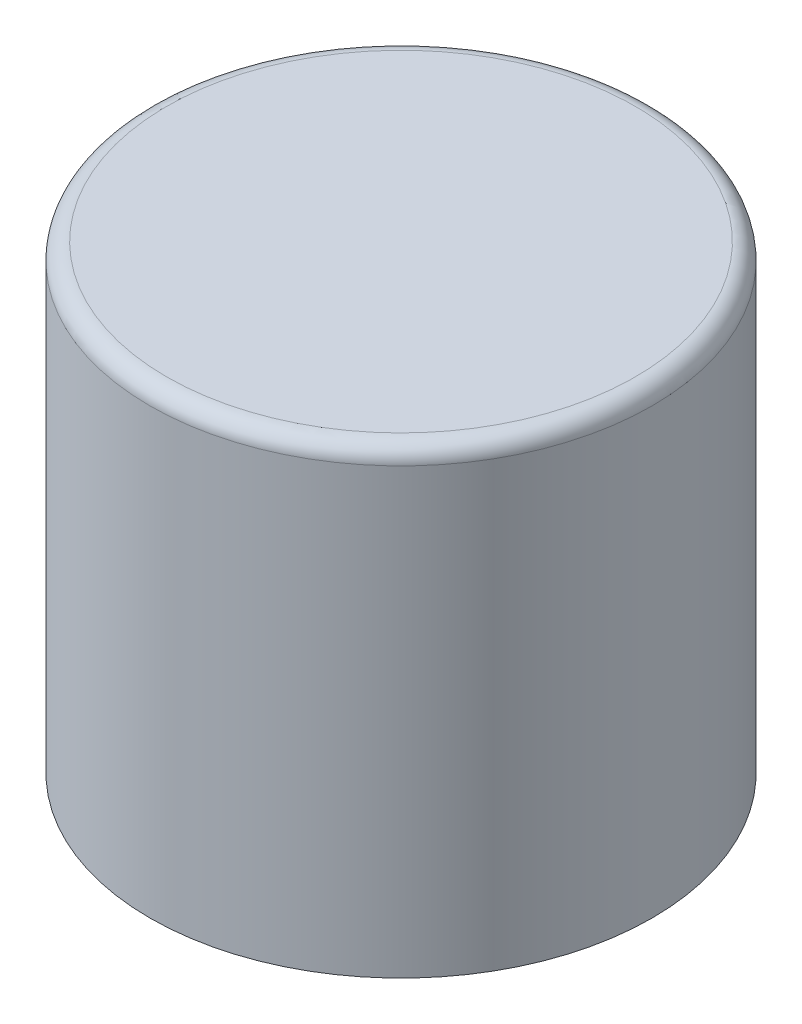
ISO-10303-21;
HEADER;
FILE_DESCRIPTION(('STEP AP214'),'2;1');
FILE_NAME('part.step','',(''),(''),'','','');
FILE_SCHEMA(('AUTOMOTIVE_DESIGN { 1 0 10303 214 1 1 1 1 }'));
ENDSEC;
DATA;
#1=APPLICATION_CONTEXT('core data for automotive mechanical design processes');
#2=APPLICATION_PROTOCOL_DEFINITION('international standard','automotive_design',2000,#1);
#3=PRODUCT_CONTEXT('',#1,'mechanical');
#4=PRODUCT('Part','Part','',(#3));
#5=PRODUCT_RELATED_PRODUCT_CATEGORY('part','',(#4));
#6=PRODUCT_DEFINITION_FORMATION('','',#4);
#7=PRODUCT_DEFINITION_CONTEXT('part definition',#1,'design');
#8=PRODUCT_DEFINITION('design','',#6,#7);
#9=PRODUCT_DEFINITION_SHAPE('','',#8);
#10=(LENGTH_UNIT() NAMED_UNIT(*) SI_UNIT(.MILLI.,.METRE.));
#11=(NAMED_UNIT(*) PLANE_ANGLE_UNIT() SI_UNIT($,.RADIAN.));
#12=(NAMED_UNIT(*) SI_UNIT($,.STERADIAN.) SOLID_ANGLE_UNIT());
#13=UNCERTAINTY_MEASURE_WITH_UNIT(LENGTH_MEASURE(1.E-05),#10,'distance_accuracy_value','');
#14=(GEOMETRIC_REPRESENTATION_CONTEXT(3) GLOBAL_UNCERTAINTY_ASSIGNED_CONTEXT((#13)) GLOBAL_UNIT_ASSIGNED_CONTEXT((#10,
#11,#12)) REPRESENTATION_CONTEXT('',''));
#15=CARTESIAN_POINT('',(0.,0.,0.));
#16=DIRECTION('',(0.,0.,1.));
#17=DIRECTION('',(1.,0.,0.));
#18=AXIS2_PLACEMENT_3D('',#15,#16,#17);
#19=CARTESIAN_POINT('',(0.,0.,0.));
#20=DIRECTION('',(0.,1.,0.));
#21=DIRECTION('',(0.,0.,1.));
#22=AXIS2_PLACEMENT_3D('',#19,#20,#21);
#23=CYLINDRICAL_SURFACE('',#22,3.);
#24=CARTESIAN_POINT('',(0.,5.3,0.));
#25=DIRECTION('',(0.,1.,0.));
#26=DIRECTION('',(0.,0.,1.));
#27=AXIS2_PLACEMENT_3D('',#24,#25,#26);
#28=CIRCLE('',#27,3.);
#29=CARTESIAN_POINT('',(0.,5.3,3.));
#30=VERTEX_POINT('',#29);
#31=EDGE_CURVE('E11',#30,#30,#28,.F.);
#32=ORIENTED_EDGE('',*,*,#31,.T.);
#33=EDGE_LOOP('',(#32));
#34=FACE_BOUND('',#33,.T.);
#35=CARTESIAN_POINT('',(0.,0.,0.));
#36=DIRECTION('',(0.,1.,0.));
#37=DIRECTION('',(0.,0.,1.));
#38=AXIS2_PLACEMENT_3D('',#35,#36,#37);
#39=CIRCLE('',#38,3.);
#40=CARTESIAN_POINT('',(0.,0.,3.));
#41=VERTEX_POINT('',#40);
#42=EDGE_CURVE('E112',#41,#41,#39,.T.);
#43=ORIENTED_EDGE('',*,*,#42,.T.);
#44=EDGE_LOOP('',(#43));
#45=FACE_BOUND('',#44,.T.);
#46=ADVANCED_FACE('F36',(#34,#45),#23,.T.);
#47=CARTESIAN_POINT('',(3.,0.,0.));
#48=DIRECTION('',(0.,-1.,0.));
#49=DIRECTION('',(0.,0.,-1.));
#50=AXIS2_PLACEMENT_3D('',#47,#48,#49);
#51=PLANE('',#50);
#52=DIRECTION('',(0.,0.,1.));
#53=VECTOR('',#52,1.);
#54=CARTESIAN_POINT('',(1.25,0.,-1.25));
#55=LINE('',#54,#53);
#56=CARTESIAN_POINT('',(1.25,0.,-1.25));
#57=VERTEX_POINT('',#56);
#58=CARTESIAN_POINT('',(1.25,0.,1.25));
#59=VERTEX_POINT('',#58);
#60=EDGE_CURVE('E51',#57,#59,#55,.T.);
#61=ORIENTED_EDGE('',*,*,#60,.F.);
#62=DIRECTION('',(1.,0.,0.));
#63=VECTOR('',#62,1.);
#64=CARTESIAN_POINT('',(-1.25,0.,-1.25));
#65=LINE('',#64,#63);
#66=CARTESIAN_POINT('',(-1.25,0.,-1.25));
#67=VERTEX_POINT('',#66);
#68=EDGE_CURVE('E102',#67,#57,#65,.T.);
#69=ORIENTED_EDGE('',*,*,#68,.F.);
#70=DIRECTION('',(0.,0.,-1.));
#71=VECTOR('',#70,1.);
#72=CARTESIAN_POINT('',(-1.25,0.,1.25));
#73=LINE('',#72,#71);
#74=CARTESIAN_POINT('',(-1.25,0.,1.25));
#75=VERTEX_POINT('',#74);
#76=EDGE_CURVE('E108',#75,#67,#73,.T.);
#77=ORIENTED_EDGE('',*,*,#76,.F.);
#78=DIRECTION('',(-1.,0.,0.));
#79=VECTOR('',#78,1.);
#80=CARTESIAN_POINT('',(1.25,0.,1.25));
#81=LINE('',#80,#79);
#82=EDGE_CURVE('E86',#59,#75,#81,.T.);
#83=ORIENTED_EDGE('',*,*,#82,.F.);
#84=EDGE_LOOP('',(#61,#69,#77,#83));
#85=FACE_BOUND('',#84,.T.);
#86=ORIENTED_EDGE('',*,*,#42,.F.);
#87=EDGE_LOOP('',(#86));
#88=FACE_BOUND('',#87,.T.);
#89=ADVANCED_FACE('F128',(#85,#88),#51,.T.);
#90=CARTESIAN_POINT('',(0.,5.5,0.));
#91=DIRECTION('',(0.,1.,0.));
#92=DIRECTION('',(0.,0.,1.));
#93=AXIS2_PLACEMENT_3D('',#90,#91,#92);
#94=PLANE('',#93);
#95=CARTESIAN_POINT('',(0.,5.5,0.));
#96=DIRECTION('',(0.,1.,0.));
#97=DIRECTION('',(0.,0.,1.));
#98=AXIS2_PLACEMENT_3D('',#95,#96,#97);
#99=CIRCLE('',#98,2.8);
#100=CARTESIAN_POINT('',(0.,5.5,2.8));
#101=VERTEX_POINT('',#100);
#102=EDGE_CURVE('E44',#101,#101,#99,.T.);
#103=ORIENTED_EDGE('',*,*,#102,.T.);
#104=EDGE_LOOP('',(#103));
#105=FACE_BOUND('',#104,.T.);
#106=ADVANCED_FACE('F119',(#105),#94,.T.);
#107=CARTESIAN_POINT('',(1.25,2.8,-1.25));
#108=DIRECTION('',(1.,0.,0.));
#109=DIRECTION('',(0.,0.,-1.));
#110=AXIS2_PLACEMENT_3D('',#107,#108,#109);
#111=PLANE('',#110);
#112=ORIENTED_EDGE('',*,*,#60,.T.);
#113=DIRECTION('',(0.,-1.,0.));
#114=VECTOR('',#113,1.);
#115=CARTESIAN_POINT('',(1.25,2.8,1.25));
#116=LINE('',#115,#114);
#117=CARTESIAN_POINT('',(1.25,2.8,1.25));
#118=VERTEX_POINT('',#117);
#119=EDGE_CURVE('E74',#118,#59,#116,.T.);
#120=ORIENTED_EDGE('',*,*,#119,.F.);
#121=DIRECTION('',(0.,0.,1.));
#122=VECTOR('',#121,1.);
#123=CARTESIAN_POINT('',(1.25,2.8,-1.25));
#124=LINE('',#123,#122);
#125=CARTESIAN_POINT('',(1.25,2.8,-1.25));
#126=VERTEX_POINT('',#125);
#127=EDGE_CURVE('E100',#126,#118,#124,.T.);
#128=ORIENTED_EDGE('',*,*,#127,.F.);
#129=DIRECTION('',(0.,-1.,0.));
#130=VECTOR('',#129,1.);
#131=CARTESIAN_POINT('',(1.25,2.8,-1.25));
#132=LINE('',#131,#130);
#133=EDGE_CURVE('E59',#126,#57,#132,.T.);
#134=ORIENTED_EDGE('',*,*,#133,.T.);
#135=EDGE_LOOP('',(#112,#120,#128,#134));
#136=FACE_BOUND('',#135,.T.);
#137=ADVANCED_FACE('F139',(#136),#111,.F.);
#138=CARTESIAN_POINT('',(-1.25,2.8,-1.25));
#139=DIRECTION('',(0.,0.,-1.));
#140=DIRECTION('',(-1.,0.,0.));
#141=AXIS2_PLACEMENT_3D('',#138,#139,#140);
#142=PLANE('',#141);
#143=ORIENTED_EDGE('',*,*,#68,.T.);
#144=ORIENTED_EDGE('',*,*,#133,.F.);
#145=DIRECTION('',(1.,0.,0.));
#146=VECTOR('',#145,1.);
#147=CARTESIAN_POINT('',(-1.25,2.8,-1.25));
#148=LINE('',#147,#146);
#149=CARTESIAN_POINT('',(-1.25,2.8,-1.25));
#150=VERTEX_POINT('',#149);
#151=EDGE_CURVE('E97',#150,#126,#148,.T.);
#152=ORIENTED_EDGE('',*,*,#151,.F.);
#153=DIRECTION('',(0.,-1.,0.));
#154=VECTOR('',#153,1.);
#155=CARTESIAN_POINT('',(-1.25,2.8,-1.25));
#156=LINE('',#155,#154);
#157=EDGE_CURVE('E90',#150,#67,#156,.T.);
#158=ORIENTED_EDGE('',*,*,#157,.T.);
#159=EDGE_LOOP('',(#143,#144,#152,#158));
#160=FACE_BOUND('',#159,.T.);
#161=ADVANCED_FACE('F142',(#160),#142,.F.);
#162=CARTESIAN_POINT('',(-1.25,2.8,1.25));
#163=DIRECTION('',(-1.,0.,0.));
#164=DIRECTION('',(0.,0.,1.));
#165=AXIS2_PLACEMENT_3D('',#162,#163,#164);
#166=PLANE('',#165);
#167=ORIENTED_EDGE('',*,*,#76,.T.);
#168=ORIENTED_EDGE('',*,*,#157,.F.);
#169=DIRECTION('',(0.,0.,-1.));
#170=VECTOR('',#169,1.);
#171=CARTESIAN_POINT('',(-1.25,2.8,1.25));
#172=LINE('',#171,#170);
#173=CARTESIAN_POINT('',(-1.25,2.8,1.25));
#174=VERTEX_POINT('',#173);
#175=EDGE_CURVE('E93',#174,#150,#172,.T.);
#176=ORIENTED_EDGE('',*,*,#175,.F.);
#177=DIRECTION('',(0.,-1.,0.));
#178=VECTOR('',#177,1.);
#179=CARTESIAN_POINT('',(-1.25,2.8,1.25));
#180=LINE('',#179,#178);
#181=EDGE_CURVE('E79',#174,#75,#180,.T.);
#182=ORIENTED_EDGE('',*,*,#181,.T.);
#183=EDGE_LOOP('',(#167,#168,#176,#182));
#184=FACE_BOUND('',#183,.T.);
#185=ADVANCED_FACE('F94',(#184),#166,.F.);
#186=CARTESIAN_POINT('',(1.25,2.8,1.25));
#187=DIRECTION('',(0.,0.,1.));
#188=DIRECTION('',(1.,0.,0.));
#189=AXIS2_PLACEMENT_3D('',#186,#187,#188);
#190=PLANE('',#189);
#191=ORIENTED_EDGE('',*,*,#82,.T.);
#192=ORIENTED_EDGE('',*,*,#181,.F.);
#193=DIRECTION('',(-1.,0.,0.));
#194=VECTOR('',#193,1.);
#195=CARTESIAN_POINT('',(1.25,2.8,1.25));
#196=LINE('',#195,#194);
#197=EDGE_CURVE('E83',#118,#174,#196,.T.);
#198=ORIENTED_EDGE('',*,*,#197,.F.);
#199=ORIENTED_EDGE('',*,*,#119,.T.);
#200=EDGE_LOOP('',(#191,#192,#198,#199));
#201=FACE_BOUND('',#200,.T.);
#202=ADVANCED_FACE('F81',(#201),#190,.F.);
#203=CARTESIAN_POINT('',(0.,2.8,0.));
#204=DIRECTION('',(0.,-1.,0.));
#205=DIRECTION('',(0.,0.,-1.));
#206=AXIS2_PLACEMENT_3D('',#203,#204,#205);
#207=PLANE('',#206);
#208=ORIENTED_EDGE('',*,*,#127,.T.);
#209=ORIENTED_EDGE('',*,*,#197,.T.);
#210=ORIENTED_EDGE('',*,*,#175,.T.);
#211=ORIENTED_EDGE('',*,*,#151,.T.);
#212=EDGE_LOOP('',(#208,#209,#210,#211));
#213=FACE_BOUND('',#212,.T.);
#214=ADVANCED_FACE('F99',(#213),#207,.T.);
#215=CARTESIAN_POINT('',(0.,5.3,0.));
#216=DIRECTION('',(0.,1.,0.));
#217=DIRECTION('',(0.,0.,1.));
#218=AXIS2_PLACEMENT_3D('',#215,#216,#217);
#219=TOROIDAL_SURFACE('',#218,2.8,0.2);
#220=ORIENTED_EDGE('',*,*,#31,.F.);
#221=EDGE_LOOP('',(#220));
#222=FACE_BOUND('',#221,.T.);
#223=ORIENTED_EDGE('',*,*,#102,.F.);
#224=EDGE_LOOP('',(#223));
#225=FACE_BOUND('',#224,.T.);
#226=ADVANCED_FACE('F38',(#222,#225),#219,.T.);
#227=CLOSED_SHELL('',(#46,#89,#106,#137,#161,#185,#202,#214,#226));
#228=MANIFOLD_SOLID_BREP('B2',#227);
#229=ADVANCED_BREP_SHAPE_REPRESENTATION('',(#18,#228),#14);
#230=SHAPE_DEFINITION_REPRESENTATION(#9,#229);
ENDSEC;
END-ISO-10303-21;
